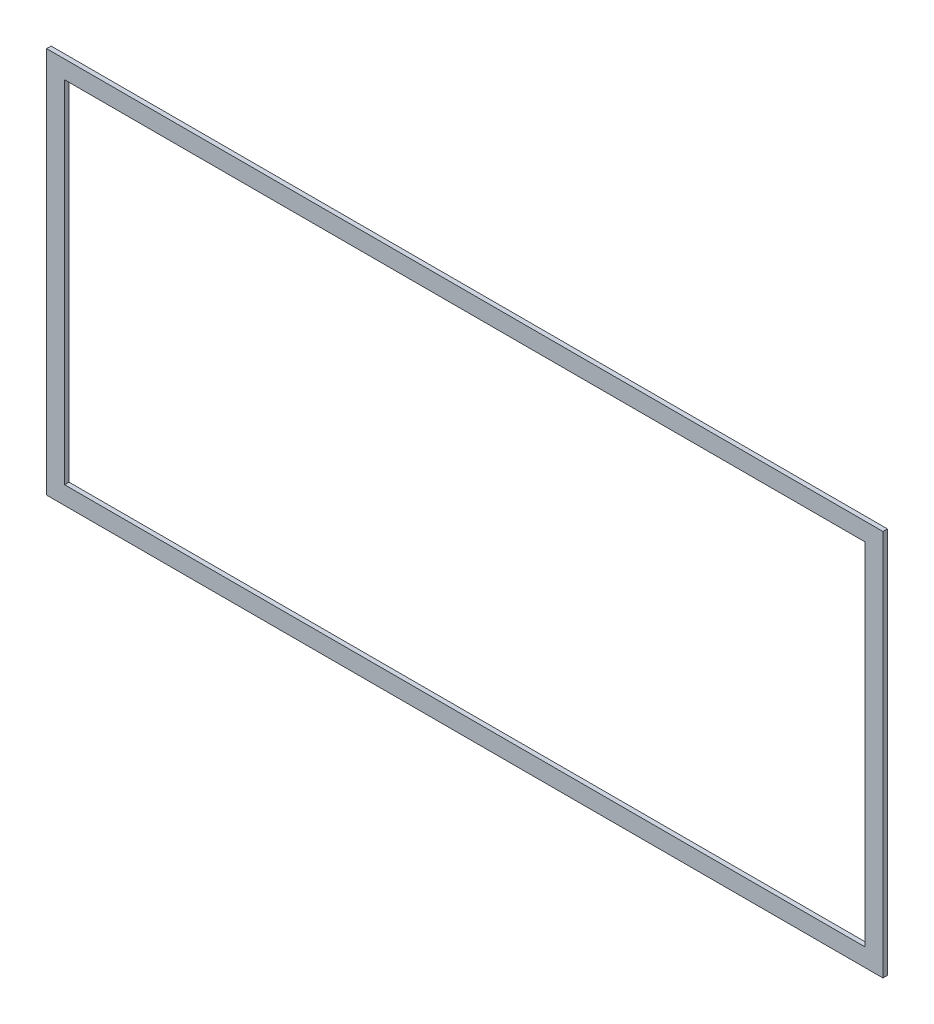
ISO-10303-21;
HEADER;
FILE_DESCRIPTION(('STEP AP214'),'2;1');
FILE_NAME('part.step','',(''),(''),'','','');
FILE_SCHEMA(('AUTOMOTIVE_DESIGN { 1 0 10303 214 1 1 1 1 }'));
ENDSEC;
DATA;
#1=APPLICATION_CONTEXT('core data for automotive mechanical design processes');
#2=APPLICATION_PROTOCOL_DEFINITION('international standard','automotive_design',2000,#1);
#3=PRODUCT_CONTEXT('',#1,'mechanical');
#4=PRODUCT('Part','Part','',(#3));
#5=PRODUCT_RELATED_PRODUCT_CATEGORY('part','',(#4));
#6=PRODUCT_DEFINITION_FORMATION('','',#4);
#7=PRODUCT_DEFINITION_CONTEXT('part definition',#1,'design');
#8=PRODUCT_DEFINITION('design','',#6,#7);
#9=PRODUCT_DEFINITION_SHAPE('','',#8);
#10=(LENGTH_UNIT() NAMED_UNIT(*) SI_UNIT(.MILLI.,.METRE.));
#11=(NAMED_UNIT(*) PLANE_ANGLE_UNIT() SI_UNIT($,.RADIAN.));
#12=(NAMED_UNIT(*) SI_UNIT($,.STERADIAN.) SOLID_ANGLE_UNIT());
#13=UNCERTAINTY_MEASURE_WITH_UNIT(LENGTH_MEASURE(1.E-05),#10,'distance_accuracy_value','');
#14=(GEOMETRIC_REPRESENTATION_CONTEXT(3) GLOBAL_UNCERTAINTY_ASSIGNED_CONTEXT((#13)) GLOBAL_UNIT_ASSIGNED_CONTEXT((#10,
#11,#12)) REPRESENTATION_CONTEXT('',''));
#15=CARTESIAN_POINT('',(0.,0.,0.));
#16=DIRECTION('',(0.,0.,1.));
#17=DIRECTION('',(1.,0.,0.));
#18=AXIS2_PLACEMENT_3D('',#15,#16,#17);
#19=CARTESIAN_POINT('',(0.,0.,-2.5));
#20=DIRECTION('',(0.,0.,1.));
#21=DIRECTION('',(1.,0.,0.));
#22=AXIS2_PLACEMENT_3D('',#19,#20,#21);
#23=PLANE('',#22);
#24=DIRECTION('',(1.,0.,0.));
#25=VECTOR('',#24,1.);
#26=CARTESIAN_POINT('',(0.,195.,-2.5));
#27=LINE('',#26,#25);
#28=CARTESIAN_POINT('',(445.,195.,-2.5));
#29=VERTEX_POINT('',#28);
#30=CARTESIAN_POINT('',(-445.,195.,-2.5));
#31=VERTEX_POINT('',#30);
#32=EDGE_CURVE('E136',#29,#31,#27,.F.);
#33=ORIENTED_EDGE('',*,*,#32,.T.);
#34=DIRECTION('',(0.,1.,0.));
#35=VECTOR('',#34,1.);
#36=CARTESIAN_POINT('',(-445.,0.,-2.5));
#37=LINE('',#36,#35);
#38=CARTESIAN_POINT('',(-445.,-195.,-2.5));
#39=VERTEX_POINT('',#38);
#40=EDGE_CURVE('E133',#39,#31,#37,.T.);
#41=ORIENTED_EDGE('',*,*,#40,.F.);
#42=DIRECTION('',(1.,0.,0.));
#43=VECTOR('',#42,1.);
#44=CARTESIAN_POINT('',(0.,-195.,-2.5));
#45=LINE('',#44,#43);
#46=CARTESIAN_POINT('',(445.,-195.,-2.5));
#47=VERTEX_POINT('',#46);
#48=EDGE_CURVE('E145',#47,#39,#45,.F.);
#49=ORIENTED_EDGE('',*,*,#48,.F.);
#50=DIRECTION('',(0.,1.,0.));
#51=VECTOR('',#50,1.);
#52=CARTESIAN_POINT('',(445.,0.,-2.5));
#53=LINE('',#52,#51);
#54=EDGE_CURVE('E140',#47,#29,#53,.T.);
#55=ORIENTED_EDGE('',*,*,#54,.T.);
#56=EDGE_LOOP('',(#33,#41,#49,#55));
#57=FACE_BOUND('',#56,.T.);
#58=DIRECTION('',(0.,1.,0.));
#59=VECTOR('',#58,1.);
#60=CARTESIAN_POINT('',(465.,215.,-2.5));
#61=LINE('',#60,#59);
#62=CARTESIAN_POINT('',(465.,-215.,-2.5));
#63=VERTEX_POINT('',#62);
#64=CARTESIAN_POINT('',(465.,215.,-2.5));
#65=VERTEX_POINT('',#64);
#66=EDGE_CURVE('E45',#63,#65,#61,.T.);
#67=ORIENTED_EDGE('',*,*,#66,.F.);
#68=DIRECTION('',(1.,0.,0.));
#69=VECTOR('',#68,1.);
#70=CARTESIAN_POINT('',(-465.,-215.,-2.5));
#71=LINE('',#70,#69);
#72=CARTESIAN_POINT('',(-465.,-215.,-2.5));
#73=VERTEX_POINT('',#72);
#74=EDGE_CURVE('E128',#63,#73,#71,.F.);
#75=ORIENTED_EDGE('',*,*,#74,.T.);
#76=DIRECTION('',(0.,1.,0.));
#77=VECTOR('',#76,1.);
#78=CARTESIAN_POINT('',(-465.,215.,-2.5));
#79=LINE('',#78,#77);
#80=CARTESIAN_POINT('',(-465.,215.,-2.5));
#81=VERTEX_POINT('',#80);
#82=EDGE_CURVE('E104',#73,#81,#79,.T.);
#83=ORIENTED_EDGE('',*,*,#82,.T.);
#84=DIRECTION('',(1.,0.,0.));
#85=VECTOR('',#84,1.);
#86=CARTESIAN_POINT('',(-465.,215.,-2.5));
#87=LINE('',#86,#85);
#88=EDGE_CURVE('E116',#65,#81,#87,.F.);
#89=ORIENTED_EDGE('',*,*,#88,.F.);
#90=EDGE_LOOP('',(#67,#75,#83,#89));
#91=FACE_BOUND('',#90,.T.);
#92=ADVANCED_FACE('F42',(#57,#91),#23,.F.);
#93=CARTESIAN_POINT('',(465.,215.,2.5));
#94=DIRECTION('',(1.,0.,0.));
#95=DIRECTION('',(0.,0.,-1.));
#96=AXIS2_PLACEMENT_3D('',#93,#94,#95);
#97=PLANE('',#96);
#98=ORIENTED_EDGE('',*,*,#66,.T.);
#99=DIRECTION('',(0.,0.,1.));
#100=VECTOR('',#99,1.);
#101=CARTESIAN_POINT('',(465.,215.,2.5));
#102=LINE('',#101,#100);
#103=CARTESIAN_POINT('',(465.,215.,2.5));
#104=VERTEX_POINT('',#103);
#105=EDGE_CURVE('E111',#104,#65,#102,.F.);
#106=ORIENTED_EDGE('',*,*,#105,.F.);
#107=DIRECTION('',(0.,1.,0.));
#108=VECTOR('',#107,1.);
#109=CARTESIAN_POINT('',(465.,0.,2.5));
#110=LINE('',#109,#108);
#111=CARTESIAN_POINT('',(465.,-215.,2.5));
#112=VERTEX_POINT('',#111);
#113=EDGE_CURVE('E151',#112,#104,#110,.T.);
#114=ORIENTED_EDGE('',*,*,#113,.F.);
#115=DIRECTION('',(0.,0.,1.));
#116=VECTOR('',#115,1.);
#117=CARTESIAN_POINT('',(465.,-215.,2.5));
#118=LINE('',#117,#116);
#119=EDGE_CURVE('E114',#112,#63,#118,.F.);
#120=ORIENTED_EDGE('',*,*,#119,.T.);
#121=EDGE_LOOP('',(#98,#106,#114,#120));
#122=FACE_BOUND('',#121,.T.);
#123=ADVANCED_FACE('F109',(#122),#97,.T.);
#124=CARTESIAN_POINT('',(-465.,215.,2.5));
#125=DIRECTION('',(0.,1.,0.));
#126=DIRECTION('',(0.,0.,1.));
#127=AXIS2_PLACEMENT_3D('',#124,#125,#126);
#128=PLANE('',#127);
#129=ORIENTED_EDGE('',*,*,#88,.T.);
#130=DIRECTION('',(0.,0.,-1.));
#131=VECTOR('',#130,1.);
#132=CARTESIAN_POINT('',(-465.,215.,2.5));
#133=LINE('',#132,#131);
#134=CARTESIAN_POINT('',(-465.,215.,2.5));
#135=VERTEX_POINT('',#134);
#136=EDGE_CURVE('E126',#81,#135,#133,.F.);
#137=ORIENTED_EDGE('',*,*,#136,.T.);
#138=DIRECTION('',(1.,0.,0.));
#139=VECTOR('',#138,1.);
#140=CARTESIAN_POINT('',(0.,215.,2.5));
#141=LINE('',#140,#139);
#142=EDGE_CURVE('E122',#104,#135,#141,.F.);
#143=ORIENTED_EDGE('',*,*,#142,.F.);
#144=ORIENTED_EDGE('',*,*,#105,.T.);
#145=EDGE_LOOP('',(#129,#137,#143,#144));
#146=FACE_BOUND('',#145,.T.);
#147=ADVANCED_FACE('F120',(#146),#128,.T.);
#148=CARTESIAN_POINT('',(-465.,215.,2.5));
#149=DIRECTION('',(1.,0.,0.));
#150=DIRECTION('',(0.,0.,-1.));
#151=AXIS2_PLACEMENT_3D('',#148,#149,#150);
#152=PLANE('',#151);
#153=DIRECTION('',(0.,1.,0.));
#154=VECTOR('',#153,1.);
#155=CARTESIAN_POINT('',(-465.,0.,2.5));
#156=LINE('',#155,#154);
#157=CARTESIAN_POINT('',(-465.,-215.,2.5));
#158=VERTEX_POINT('',#157);
#159=EDGE_CURVE('E154',#135,#158,#156,.F.);
#160=ORIENTED_EDGE('',*,*,#159,.F.);
#161=ORIENTED_EDGE('',*,*,#136,.F.);
#162=ORIENTED_EDGE('',*,*,#82,.F.);
#163=DIRECTION('',(0.,0.,1.));
#164=VECTOR('',#163,1.);
#165=CARTESIAN_POINT('',(-465.,-215.,2.5));
#166=LINE('',#165,#164);
#167=EDGE_CURVE('E130',#73,#158,#166,.T.);
#168=ORIENTED_EDGE('',*,*,#167,.T.);
#169=EDGE_LOOP('',(#160,#161,#162,#168));
#170=FACE_BOUND('',#169,.T.);
#171=ADVANCED_FACE('F200',(#170),#152,.F.);
#172=CARTESIAN_POINT('',(-465.,-215.,2.5));
#173=DIRECTION('',(0.,1.,0.));
#174=DIRECTION('',(0.,0.,1.));
#175=AXIS2_PLACEMENT_3D('',#172,#173,#174);
#176=PLANE('',#175);
#177=DIRECTION('',(1.,0.,0.));
#178=VECTOR('',#177,1.);
#179=CARTESIAN_POINT('',(0.,-215.,2.5));
#180=LINE('',#179,#178);
#181=EDGE_CURVE('E157',#158,#112,#180,.T.);
#182=ORIENTED_EDGE('',*,*,#181,.F.);
#183=ORIENTED_EDGE('',*,*,#167,.F.);
#184=ORIENTED_EDGE('',*,*,#74,.F.);
#185=ORIENTED_EDGE('',*,*,#119,.F.);
#186=EDGE_LOOP('',(#182,#183,#184,#185));
#187=FACE_BOUND('',#186,.T.);
#188=ADVANCED_FACE('F197',(#187),#176,.F.);
#189=CARTESIAN_POINT('',(-445.,0.,2.5));
#190=DIRECTION('',(1.,0.,0.));
#191=DIRECTION('',(0.,0.,-1.));
#192=AXIS2_PLACEMENT_3D('',#189,#190,#191);
#193=PLANE('',#192);
#194=ORIENTED_EDGE('',*,*,#40,.T.);
#195=DIRECTION('',(0.,0.,1.));
#196=VECTOR('',#195,1.);
#197=CARTESIAN_POINT('',(-445.,195.,2.5));
#198=LINE('',#197,#196);
#199=CARTESIAN_POINT('',(-445.,195.,2.5));
#200=VERTEX_POINT('',#199);
#201=EDGE_CURVE('E138',#31,#200,#198,.T.);
#202=ORIENTED_EDGE('',*,*,#201,.T.);
#203=DIRECTION('',(0.,1.,0.));
#204=VECTOR('',#203,1.);
#205=CARTESIAN_POINT('',(-445.,0.,2.5));
#206=LINE('',#205,#204);
#207=CARTESIAN_POINT('',(-445.,-195.,2.5));
#208=VERTEX_POINT('',#207);
#209=EDGE_CURVE('E160',#208,#200,#206,.T.);
#210=ORIENTED_EDGE('',*,*,#209,.F.);
#211=DIRECTION('',(0.,0.,1.));
#212=VECTOR('',#211,1.);
#213=CARTESIAN_POINT('',(-445.,-195.,2.5));
#214=LINE('',#213,#212);
#215=EDGE_CURVE('E148',#39,#208,#214,.T.);
#216=ORIENTED_EDGE('',*,*,#215,.F.);
#217=EDGE_LOOP('',(#194,#202,#210,#216));
#218=FACE_BOUND('',#217,.T.);
#219=ADVANCED_FACE('F181',(#218),#193,.T.);
#220=CARTESIAN_POINT('',(0.,195.,2.5));
#221=DIRECTION('',(0.,1.,0.));
#222=DIRECTION('',(0.,0.,1.));
#223=AXIS2_PLACEMENT_3D('',#220,#221,#222);
#224=PLANE('',#223);
#225=DIRECTION('',(1.,0.,0.));
#226=VECTOR('',#225,1.);
#227=CARTESIAN_POINT('',(0.,195.,2.5));
#228=LINE('',#227,#226);
#229=CARTESIAN_POINT('',(445.,195.,2.5));
#230=VERTEX_POINT('',#229);
#231=EDGE_CURVE('E163',#200,#230,#228,.T.);
#232=ORIENTED_EDGE('',*,*,#231,.F.);
#233=ORIENTED_EDGE('',*,*,#201,.F.);
#234=ORIENTED_EDGE('',*,*,#32,.F.);
#235=DIRECTION('',(0.,0.,-1.));
#236=VECTOR('',#235,1.);
#237=CARTESIAN_POINT('',(445.,195.,2.5));
#238=LINE('',#237,#236);
#239=EDGE_CURVE('E142',#29,#230,#238,.F.);
#240=ORIENTED_EDGE('',*,*,#239,.T.);
#241=EDGE_LOOP('',(#232,#233,#234,#240));
#242=FACE_BOUND('',#241,.T.);
#243=ADVANCED_FACE('F176',(#242),#224,.F.);
#244=CARTESIAN_POINT('',(445.,0.,2.5));
#245=DIRECTION('',(1.,0.,0.));
#246=DIRECTION('',(0.,0.,-1.));
#247=AXIS2_PLACEMENT_3D('',#244,#245,#246);
#248=PLANE('',#247);
#249=DIRECTION('',(0.,1.,0.));
#250=VECTOR('',#249,1.);
#251=CARTESIAN_POINT('',(445.,0.,2.5));
#252=LINE('',#251,#250);
#253=CARTESIAN_POINT('',(445.,-195.,2.5));
#254=VERTEX_POINT('',#253);
#255=EDGE_CURVE('E51',#230,#254,#252,.F.);
#256=ORIENTED_EDGE('',*,*,#255,.F.);
#257=ORIENTED_EDGE('',*,*,#239,.F.);
#258=ORIENTED_EDGE('',*,*,#54,.F.);
#259=DIRECTION('',(0.,0.,1.));
#260=VECTOR('',#259,1.);
#261=CARTESIAN_POINT('',(445.,-195.,2.5));
#262=LINE('',#261,#260);
#263=EDGE_CURVE('E60',#254,#47,#262,.F.);
#264=ORIENTED_EDGE('',*,*,#263,.F.);
#265=EDGE_LOOP('',(#256,#257,#258,#264));
#266=FACE_BOUND('',#265,.T.);
#267=ADVANCED_FACE('F172',(#266),#248,.F.);
#268=CARTESIAN_POINT('',(0.,-195.,2.5));
#269=DIRECTION('',(0.,1.,0.));
#270=DIRECTION('',(0.,0.,1.));
#271=AXIS2_PLACEMENT_3D('',#268,#269,#270);
#272=PLANE('',#271);
#273=ORIENTED_EDGE('',*,*,#48,.T.);
#274=ORIENTED_EDGE('',*,*,#215,.T.);
#275=DIRECTION('',(1.,0.,0.));
#276=VECTOR('',#275,1.);
#277=CARTESIAN_POINT('',(0.,-195.,2.5));
#278=LINE('',#277,#276);
#279=EDGE_CURVE('E11',#254,#208,#278,.F.);
#280=ORIENTED_EDGE('',*,*,#279,.F.);
#281=ORIENTED_EDGE('',*,*,#263,.T.);
#282=EDGE_LOOP('',(#273,#274,#280,#281));
#283=FACE_BOUND('',#282,.T.);
#284=ADVANCED_FACE('F183',(#283),#272,.T.);
#285=CARTESIAN_POINT('',(0.,0.,2.5));
#286=DIRECTION('',(0.,0.,1.));
#287=DIRECTION('',(1.,0.,0.));
#288=AXIS2_PLACEMENT_3D('',#285,#286,#287);
#289=PLANE('',#288);
#290=ORIENTED_EDGE('',*,*,#255,.T.);
#291=ORIENTED_EDGE('',*,*,#279,.T.);
#292=ORIENTED_EDGE('',*,*,#209,.T.);
#293=ORIENTED_EDGE('',*,*,#231,.T.);
#294=EDGE_LOOP('',(#290,#291,#292,#293));
#295=FACE_BOUND('',#294,.T.);
#296=ORIENTED_EDGE('',*,*,#159,.T.);
#297=ORIENTED_EDGE('',*,*,#181,.T.);
#298=ORIENTED_EDGE('',*,*,#113,.T.);
#299=ORIENTED_EDGE('',*,*,#142,.T.);
#300=EDGE_LOOP('',(#296,#297,#298,#299));
#301=FACE_BOUND('',#300,.T.);
#302=ADVANCED_FACE('F168',(#295,#301),#289,.T.);
#303=CLOSED_SHELL('',(#92,#123,#147,#171,#188,#219,#243,#267,#284,#302));
#304=MANIFOLD_SOLID_BREP('B2',#303);
#305=ADVANCED_BREP_SHAPE_REPRESENTATION('',(#18,#304),#14);
#306=SHAPE_DEFINITION_REPRESENTATION(#9,#305);
ENDSEC;
END-ISO-10303-21;
